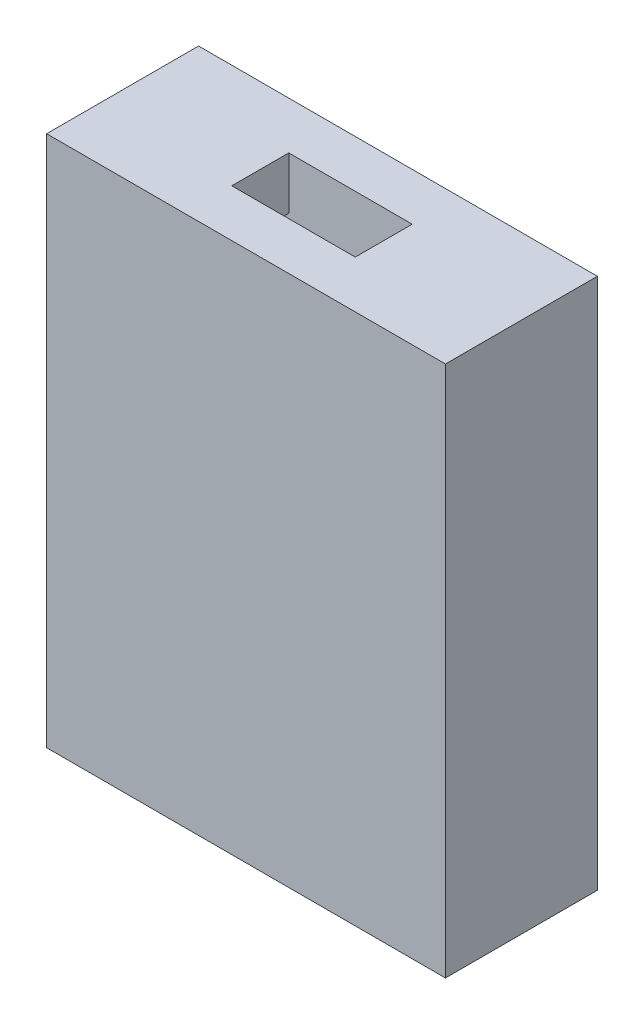
ISO-10303-21;
HEADER;
FILE_DESCRIPTION(('STEP AP214'),'2;1');
FILE_NAME('part.step','',(''),(''),'','','');
FILE_SCHEMA(('AUTOMOTIVE_DESIGN { 1 0 10303 214 1 1 1 1 }'));
ENDSEC;
DATA;
#1=APPLICATION_CONTEXT('core data for automotive mechanical design processes');
#2=APPLICATION_PROTOCOL_DEFINITION('international standard','automotive_design',2000,#1);
#3=PRODUCT_CONTEXT('',#1,'mechanical');
#4=PRODUCT('Part','Part','',(#3));
#5=PRODUCT_RELATED_PRODUCT_CATEGORY('part','',(#4));
#6=PRODUCT_DEFINITION_FORMATION('','',#4);
#7=PRODUCT_DEFINITION_CONTEXT('part definition',#1,'design');
#8=PRODUCT_DEFINITION('design','',#6,#7);
#9=PRODUCT_DEFINITION_SHAPE('','',#8);
#10=(LENGTH_UNIT() NAMED_UNIT(*) SI_UNIT(.MILLI.,.METRE.));
#11=(NAMED_UNIT(*) PLANE_ANGLE_UNIT() SI_UNIT($,.RADIAN.));
#12=(NAMED_UNIT(*) SI_UNIT($,.STERADIAN.) SOLID_ANGLE_UNIT());
#13=UNCERTAINTY_MEASURE_WITH_UNIT(LENGTH_MEASURE(1.E-05),#10,'distance_accuracy_value','');
#14=(GEOMETRIC_REPRESENTATION_CONTEXT(3) GLOBAL_UNCERTAINTY_ASSIGNED_CONTEXT((#13)) GLOBAL_UNIT_ASSIGNED_CONTEXT((#10,
#11,#12)) REPRESENTATION_CONTEXT('',''));
#15=CARTESIAN_POINT('',(0.,0.,0.));
#16=DIRECTION('',(0.,0.,1.));
#17=DIRECTION('',(1.,0.,0.));
#18=AXIS2_PLACEMENT_3D('',#15,#16,#17);
#19=CARTESIAN_POINT('',(21.,56.,-8.));
#20=DIRECTION('',(-1.,0.,0.));
#21=DIRECTION('',(0.,0.,1.));
#22=AXIS2_PLACEMENT_3D('',#19,#20,#21);
#23=PLANE('',#22);
#24=DIRECTION('',(0.,0.,-1.));
#25=VECTOR('',#24,1.);
#26=CARTESIAN_POINT('',(21.,0.,-8.));
#27=LINE('',#26,#25);
#28=CARTESIAN_POINT('',(21.,0.,8.));
#29=VERTEX_POINT('',#28);
#30=CARTESIAN_POINT('',(21.,0.,-8.));
#31=VERTEX_POINT('',#30);
#32=EDGE_CURVE('E160',#29,#31,#27,.T.);
#33=ORIENTED_EDGE('',*,*,#32,.T.);
#34=DIRECTION('',(0.,-1.,0.));
#35=VECTOR('',#34,1.);
#36=CARTESIAN_POINT('',(21.,56.,-8.));
#37=LINE('',#36,#35);
#38=CARTESIAN_POINT('',(21.,56.,-8.));
#39=VERTEX_POINT('',#38);
#40=EDGE_CURVE('E11',#39,#31,#37,.T.);
#41=ORIENTED_EDGE('',*,*,#40,.F.);
#42=DIRECTION('',(0.,0.,-1.));
#43=VECTOR('',#42,1.);
#44=CARTESIAN_POINT('',(21.,56.,-8.));
#45=LINE('',#44,#43);
#46=CARTESIAN_POINT('',(21.,56.,8.));
#47=VERTEX_POINT('',#46);
#48=EDGE_CURVE('E166',#47,#39,#45,.T.);
#49=ORIENTED_EDGE('',*,*,#48,.F.);
#50=DIRECTION('',(0.,-1.,0.));
#51=VECTOR('',#50,1.);
#52=CARTESIAN_POINT('',(21.,56.,8.));
#53=LINE('',#52,#51);
#54=EDGE_CURVE('E176',#47,#29,#53,.T.);
#55=ORIENTED_EDGE('',*,*,#54,.T.);
#56=EDGE_LOOP('',(#33,#41,#49,#55));
#57=FACE_BOUND('',#56,.T.);
#58=ADVANCED_FACE('F37',(#57),#23,.F.);
#59=CARTESIAN_POINT('',(-21.,56.,-8.));
#60=DIRECTION('',(0.,0.,1.));
#61=DIRECTION('',(1.,0.,0.));
#62=AXIS2_PLACEMENT_3D('',#59,#60,#61);
#63=PLANE('',#62);
#64=DIRECTION('',(-1.,0.,0.));
#65=VECTOR('',#64,1.);
#66=CARTESIAN_POINT('',(-21.,0.,-8.));
#67=LINE('',#66,#65);
#68=CARTESIAN_POINT('',(-21.,0.,-8.));
#69=VERTEX_POINT('',#68);
#70=EDGE_CURVE('E179',#31,#69,#67,.T.);
#71=ORIENTED_EDGE('',*,*,#70,.T.);
#72=DIRECTION('',(0.,-1.,0.));
#73=VECTOR('',#72,1.);
#74=CARTESIAN_POINT('',(-21.,56.,-8.));
#75=LINE('',#74,#73);
#76=CARTESIAN_POINT('',(-21.,56.,-8.));
#77=VERTEX_POINT('',#76);
#78=EDGE_CURVE('E44',#77,#69,#75,.T.);
#79=ORIENTED_EDGE('',*,*,#78,.F.);
#80=DIRECTION('',(-1.,0.,0.));
#81=VECTOR('',#80,1.);
#82=CARTESIAN_POINT('',(-21.,56.,-8.));
#83=LINE('',#82,#81);
#84=EDGE_CURVE('E169',#39,#77,#83,.T.);
#85=ORIENTED_EDGE('',*,*,#84,.F.);
#86=ORIENTED_EDGE('',*,*,#40,.T.);
#87=EDGE_LOOP('',(#71,#79,#85,#86));
#88=FACE_BOUND('',#87,.T.);
#89=ADVANCED_FACE('F207',(#88),#63,.F.);
#90=CARTESIAN_POINT('',(-21.,56.,-8.));
#91=DIRECTION('',(1.,0.,0.));
#92=DIRECTION('',(0.,0.,-1.));
#93=AXIS2_PLACEMENT_3D('',#90,#91,#92);
#94=PLANE('',#93);
#95=DIRECTION('',(0.,0.,1.));
#96=VECTOR('',#95,1.);
#97=CARTESIAN_POINT('',(-21.,50.5,3.));
#98=LINE('',#97,#96);
#99=CARTESIAN_POINT('',(-21.,50.5,-3.));
#100=VERTEX_POINT('',#99);
#101=CARTESIAN_POINT('',(-21.,50.5,3.));
#102=VERTEX_POINT('',#101);
#103=EDGE_CURVE('E135',#100,#102,#98,.T.);
#104=ORIENTED_EDGE('',*,*,#103,.T.);
#105=DIRECTION('',(0.,-1.,0.));
#106=VECTOR('',#105,1.);
#107=CARTESIAN_POINT('',(-21.,45.,3.));
#108=LINE('',#107,#106);
#109=CARTESIAN_POINT('',(-21.,45.,3.));
#110=VERTEX_POINT('',#109);
#111=EDGE_CURVE('E119',#102,#110,#108,.T.);
#112=ORIENTED_EDGE('',*,*,#111,.T.);
#113=DIRECTION('',(0.,0.,-1.));
#114=VECTOR('',#113,1.);
#115=CARTESIAN_POINT('',(-21.,45.,3.));
#116=LINE('',#115,#114);
#117=CARTESIAN_POINT('',(-21.,45.,-3.));
#118=VERTEX_POINT('',#117);
#119=EDGE_CURVE('E126',#110,#118,#116,.T.);
#120=ORIENTED_EDGE('',*,*,#119,.T.);
#121=DIRECTION('',(0.,1.,0.));
#122=VECTOR('',#121,1.);
#123=CARTESIAN_POINT('',(-21.,45.,-3.));
#124=LINE('',#123,#122);
#125=EDGE_CURVE('E130',#118,#100,#124,.T.);
#126=ORIENTED_EDGE('',*,*,#125,.T.);
#127=EDGE_LOOP('',(#104,#112,#120,#126));
#128=FACE_BOUND('',#127,.T.);
#129=DIRECTION('',(0.,0.,1.));
#130=VECTOR('',#129,1.);
#131=CARTESIAN_POINT('',(-21.,0.,-8.));
#132=LINE('',#131,#130);
#133=CARTESIAN_POINT('',(-21.,0.,8.));
#134=VERTEX_POINT('',#133);
#135=EDGE_CURVE('E181',#69,#134,#132,.T.);
#136=ORIENTED_EDGE('',*,*,#135,.T.);
#137=DIRECTION('',(0.,-1.,0.));
#138=VECTOR('',#137,1.);
#139=CARTESIAN_POINT('',(-21.,56.,8.));
#140=LINE('',#139,#138);
#141=CARTESIAN_POINT('',(-21.,56.,8.));
#142=VERTEX_POINT('',#141);
#143=EDGE_CURVE('E186',#142,#134,#140,.T.);
#144=ORIENTED_EDGE('',*,*,#143,.F.);
#145=DIRECTION('',(0.,0.,1.));
#146=VECTOR('',#145,1.);
#147=CARTESIAN_POINT('',(-21.,56.,-8.));
#148=LINE('',#147,#146);
#149=EDGE_CURVE('E172',#77,#142,#148,.T.);
#150=ORIENTED_EDGE('',*,*,#149,.F.);
#151=ORIENTED_EDGE('',*,*,#78,.T.);
#152=EDGE_LOOP('',(#136,#144,#150,#151));
#153=FACE_BOUND('',#152,.T.);
#154=ADVANCED_FACE('F132',(#128,#153),#94,.F.);
#155=CARTESIAN_POINT('',(-21.,56.,8.));
#156=DIRECTION('',(0.,0.,-1.));
#157=DIRECTION('',(-1.,0.,0.));
#158=AXIS2_PLACEMENT_3D('',#155,#156,#157);
#159=PLANE('',#158);
#160=DIRECTION('',(1.,0.,0.));
#161=VECTOR('',#160,1.);
#162=CARTESIAN_POINT('',(-21.,0.,8.));
#163=LINE('',#162,#161);
#164=EDGE_CURVE('E170',#134,#29,#163,.T.);
#165=ORIENTED_EDGE('',*,*,#164,.T.);
#166=ORIENTED_EDGE('',*,*,#54,.F.);
#167=DIRECTION('',(1.,0.,0.));
#168=VECTOR('',#167,1.);
#169=CARTESIAN_POINT('',(-21.,56.,8.));
#170=LINE('',#169,#168);
#171=EDGE_CURVE('E174',#142,#47,#170,.T.);
#172=ORIENTED_EDGE('',*,*,#171,.F.);
#173=ORIENTED_EDGE('',*,*,#143,.T.);
#174=EDGE_LOOP('',(#165,#166,#172,#173));
#175=FACE_BOUND('',#174,.T.);
#176=ADVANCED_FACE('F200',(#175),#159,.F.);
#177=CARTESIAN_POINT('',(0.,56.,0.));
#178=DIRECTION('',(0.,1.,0.));
#179=DIRECTION('',(0.,0.,1.));
#180=AXIS2_PLACEMENT_3D('',#177,#178,#179);
#181=PLANE('',#180);
#182=DIRECTION('',(0.,0.,-1.));
#183=VECTOR('',#182,1.);
#184=CARTESIAN_POINT('',(6.5,56.,3.));
#185=LINE('',#184,#183);
#186=CARTESIAN_POINT('',(6.5,56.,3.));
#187=VERTEX_POINT('',#186);
#188=CARTESIAN_POINT('',(6.5,56.,-3.));
#189=VERTEX_POINT('',#188);
#190=EDGE_CURVE('E59',#187,#189,#185,.T.);
#191=ORIENTED_EDGE('',*,*,#190,.F.);
#192=DIRECTION('',(1.,0.,0.));
#193=VECTOR('',#192,1.);
#194=CARTESIAN_POINT('',(-6.5,56.,3.));
#195=LINE('',#194,#193);
#196=CARTESIAN_POINT('',(-6.5,56.,3.));
#197=VERTEX_POINT('',#196);
#198=EDGE_CURVE('E149',#197,#187,#195,.T.);
#199=ORIENTED_EDGE('',*,*,#198,.F.);
#200=DIRECTION('',(0.,0.,1.));
#201=VECTOR('',#200,1.);
#202=CARTESIAN_POINT('',(-6.5,56.,3.));
#203=LINE('',#202,#201);
#204=CARTESIAN_POINT('',(-6.5,56.,-3.));
#205=VERTEX_POINT('',#204);
#206=EDGE_CURVE('E155',#205,#197,#203,.T.);
#207=ORIENTED_EDGE('',*,*,#206,.F.);
#208=DIRECTION('',(-1.,0.,0.));
#209=VECTOR('',#208,1.);
#210=CARTESIAN_POINT('',(-6.5,56.,-3.));
#211=LINE('',#210,#209);
#212=EDGE_CURVE('E152',#189,#205,#211,.T.);
#213=ORIENTED_EDGE('',*,*,#212,.F.);
#214=EDGE_LOOP('',(#191,#199,#207,#213));
#215=FACE_BOUND('',#214,.T.);
#216=ORIENTED_EDGE('',*,*,#48,.T.);
#217=ORIENTED_EDGE('',*,*,#84,.T.);
#218=ORIENTED_EDGE('',*,*,#149,.T.);
#219=ORIENTED_EDGE('',*,*,#171,.T.);
#220=EDGE_LOOP('',(#216,#217,#218,#219));
#221=FACE_BOUND('',#220,.T.);
#222=ADVANCED_FACE('F206',(#215,#221),#181,.T.);
#223=CARTESIAN_POINT('',(0.,0.,0.));
#224=DIRECTION('',(0.,1.,0.));
#225=DIRECTION('',(0.,0.,1.));
#226=AXIS2_PLACEMENT_3D('',#223,#224,#225);
#227=PLANE('',#226);
#228=ORIENTED_EDGE('',*,*,#32,.F.);
#229=ORIENTED_EDGE('',*,*,#164,.F.);
#230=ORIENTED_EDGE('',*,*,#135,.F.);
#231=ORIENTED_EDGE('',*,*,#70,.F.);
#232=EDGE_LOOP('',(#228,#229,#230,#231));
#233=FACE_BOUND('',#232,.T.);
#234=ADVANCED_FACE('F197',(#233),#227,.F.);
#235=CARTESIAN_POINT('',(6.5,45.,3.));
#236=DIRECTION('',(1.,0.,0.));
#237=DIRECTION('',(0.,0.,-1.));
#238=AXIS2_PLACEMENT_3D('',#235,#236,#237);
#239=PLANE('',#238);
#240=ORIENTED_EDGE('',*,*,#190,.T.);
#241=DIRECTION('',(0.,1.,0.));
#242=VECTOR('',#241,1.);
#243=CARTESIAN_POINT('',(6.5,45.,-3.));
#244=LINE('',#243,#242);
#245=CARTESIAN_POINT('',(6.5,45.,-3.));
#246=VERTEX_POINT('',#245);
#247=EDGE_CURVE('E123',#246,#189,#244,.T.);
#248=ORIENTED_EDGE('',*,*,#247,.F.);
#249=DIRECTION('',(0.,0.,-1.));
#250=VECTOR('',#249,1.);
#251=CARTESIAN_POINT('',(6.5,45.,3.));
#252=LINE('',#251,#250);
#253=CARTESIAN_POINT('',(6.5,45.,3.));
#254=VERTEX_POINT('',#253);
#255=EDGE_CURVE('E147',#254,#246,#252,.T.);
#256=ORIENTED_EDGE('',*,*,#255,.F.);
#257=DIRECTION('',(0.,1.,0.));
#258=VECTOR('',#257,1.);
#259=CARTESIAN_POINT('',(6.5,45.,3.));
#260=LINE('',#259,#258);
#261=EDGE_CURVE('E121',#254,#187,#260,.T.);
#262=ORIENTED_EDGE('',*,*,#261,.T.);
#263=EDGE_LOOP('',(#240,#248,#256,#262));
#264=FACE_BOUND('',#263,.T.);
#265=ADVANCED_FACE('F219',(#264),#239,.F.);
#266=CARTESIAN_POINT('',(-6.5,45.,3.));
#267=DIRECTION('',(0.,0.,1.));
#268=DIRECTION('',(1.,0.,0.));
#269=AXIS2_PLACEMENT_3D('',#266,#267,#268);
#270=PLANE('',#269);
#271=ORIENTED_EDGE('',*,*,#198,.T.);
#272=ORIENTED_EDGE('',*,*,#261,.F.);
#273=DIRECTION('',(1.,0.,0.));
#274=VECTOR('',#273,1.);
#275=CARTESIAN_POINT('',(-6.5,45.,3.));
#276=LINE('',#275,#274);
#277=EDGE_CURVE('E115',#110,#254,#276,.T.);
#278=ORIENTED_EDGE('',*,*,#277,.F.);
#279=ORIENTED_EDGE('',*,*,#111,.F.);
#280=DIRECTION('',(1.,0.,0.));
#281=VECTOR('',#280,1.);
#282=CARTESIAN_POINT('',(-21.,50.5,3.));
#283=LINE('',#282,#281);
#284=CARTESIAN_POINT('',(-6.5,50.5,3.));
#285=VERTEX_POINT('',#284);
#286=EDGE_CURVE('E144',#102,#285,#283,.T.);
#287=ORIENTED_EDGE('',*,*,#286,.T.);
#288=DIRECTION('',(0.,1.,0.));
#289=VECTOR('',#288,1.);
#290=CARTESIAN_POINT('',(-6.5,45.,3.));
#291=LINE('',#290,#289);
#292=EDGE_CURVE('E161',#285,#197,#291,.T.);
#293=ORIENTED_EDGE('',*,*,#292,.T.);
#294=EDGE_LOOP('',(#271,#272,#278,#279,#287,#293));
#295=FACE_BOUND('',#294,.T.);
#296=ADVANCED_FACE('F117',(#295),#270,.F.);
#297=CARTESIAN_POINT('',(-6.5,45.,3.));
#298=DIRECTION('',(-1.,0.,0.));
#299=DIRECTION('',(0.,0.,1.));
#300=AXIS2_PLACEMENT_3D('',#297,#298,#299);
#301=PLANE('',#300);
#302=ORIENTED_EDGE('',*,*,#292,.F.);
#303=DIRECTION('',(0.,0.,1.));
#304=VECTOR('',#303,1.);
#305=CARTESIAN_POINT('',(-6.5,50.5,3.));
#306=LINE('',#305,#304);
#307=CARTESIAN_POINT('',(-6.5,50.5,-3.));
#308=VERTEX_POINT('',#307);
#309=EDGE_CURVE('E136',#308,#285,#306,.T.);
#310=ORIENTED_EDGE('',*,*,#309,.F.);
#311=DIRECTION('',(0.,1.,0.));
#312=VECTOR('',#311,1.);
#313=CARTESIAN_POINT('',(-6.5,45.,-3.));
#314=LINE('',#313,#312);
#315=EDGE_CURVE('E163',#308,#205,#314,.T.);
#316=ORIENTED_EDGE('',*,*,#315,.T.);
#317=ORIENTED_EDGE('',*,*,#206,.T.);
#318=EDGE_LOOP('',(#302,#310,#316,#317));
#319=FACE_BOUND('',#318,.T.);
#320=ADVANCED_FACE('F228',(#319),#301,.F.);
#321=CARTESIAN_POINT('',(-6.5,45.,-3.));
#322=DIRECTION('',(0.,0.,-1.));
#323=DIRECTION('',(-1.,0.,0.));
#324=AXIS2_PLACEMENT_3D('',#321,#322,#323);
#325=PLANE('',#324);
#326=ORIENTED_EDGE('',*,*,#212,.T.);
#327=ORIENTED_EDGE('',*,*,#315,.F.);
#328=DIRECTION('',(1.,0.,0.));
#329=VECTOR('',#328,1.);
#330=CARTESIAN_POINT('',(-21.,50.5,-3.));
#331=LINE('',#330,#329);
#332=EDGE_CURVE('E142',#100,#308,#331,.T.);
#333=ORIENTED_EDGE('',*,*,#332,.F.);
#334=ORIENTED_EDGE('',*,*,#125,.F.);
#335=DIRECTION('',(-1.,0.,0.));
#336=VECTOR('',#335,1.);
#337=CARTESIAN_POINT('',(-6.5,45.,-3.));
#338=LINE('',#337,#336);
#339=EDGE_CURVE('E51',#246,#118,#338,.T.);
#340=ORIENTED_EDGE('',*,*,#339,.F.);
#341=ORIENTED_EDGE('',*,*,#247,.T.);
#342=EDGE_LOOP('',(#326,#327,#333,#334,#340,#341));
#343=FACE_BOUND('',#342,.T.);
#344=ADVANCED_FACE('F225',(#343),#325,.F.);
#345=CARTESIAN_POINT('',(0.,45.,0.));
#346=DIRECTION('',(0.,-1.,0.));
#347=DIRECTION('',(0.,0.,-1.));
#348=AXIS2_PLACEMENT_3D('',#345,#346,#347);
#349=PLANE('',#348);
#350=ORIENTED_EDGE('',*,*,#255,.T.);
#351=ORIENTED_EDGE('',*,*,#339,.T.);
#352=ORIENTED_EDGE('',*,*,#119,.F.);
#353=ORIENTED_EDGE('',*,*,#277,.T.);
#354=EDGE_LOOP('',(#350,#351,#352,#353));
#355=FACE_BOUND('',#354,.T.);
#356=ADVANCED_FACE('F127',(#355),#349,.F.);
#357=CARTESIAN_POINT('',(-21.,50.5,3.));
#358=DIRECTION('',(0.,1.,0.));
#359=DIRECTION('',(0.,0.,1.));
#360=AXIS2_PLACEMENT_3D('',#357,#358,#359);
#361=PLANE('',#360);
#362=ORIENTED_EDGE('',*,*,#309,.T.);
#363=ORIENTED_EDGE('',*,*,#286,.F.);
#364=ORIENTED_EDGE('',*,*,#103,.F.);
#365=ORIENTED_EDGE('',*,*,#332,.T.);
#366=EDGE_LOOP('',(#362,#363,#364,#365));
#367=FACE_BOUND('',#366,.T.);
#368=ADVANCED_FACE('F237',(#367),#361,.F.);
#369=CLOSED_SHELL('',(#58,#89,#154,#176,#222,#234,#265,#296,#320,#344,#356,#368));
#370=MANIFOLD_SOLID_BREP('B2',#369);
#371=ADVANCED_BREP_SHAPE_REPRESENTATION('',(#18,#370),#14);
#372=SHAPE_DEFINITION_REPRESENTATION(#9,#371);
ENDSEC;
END-ISO-10303-21;
